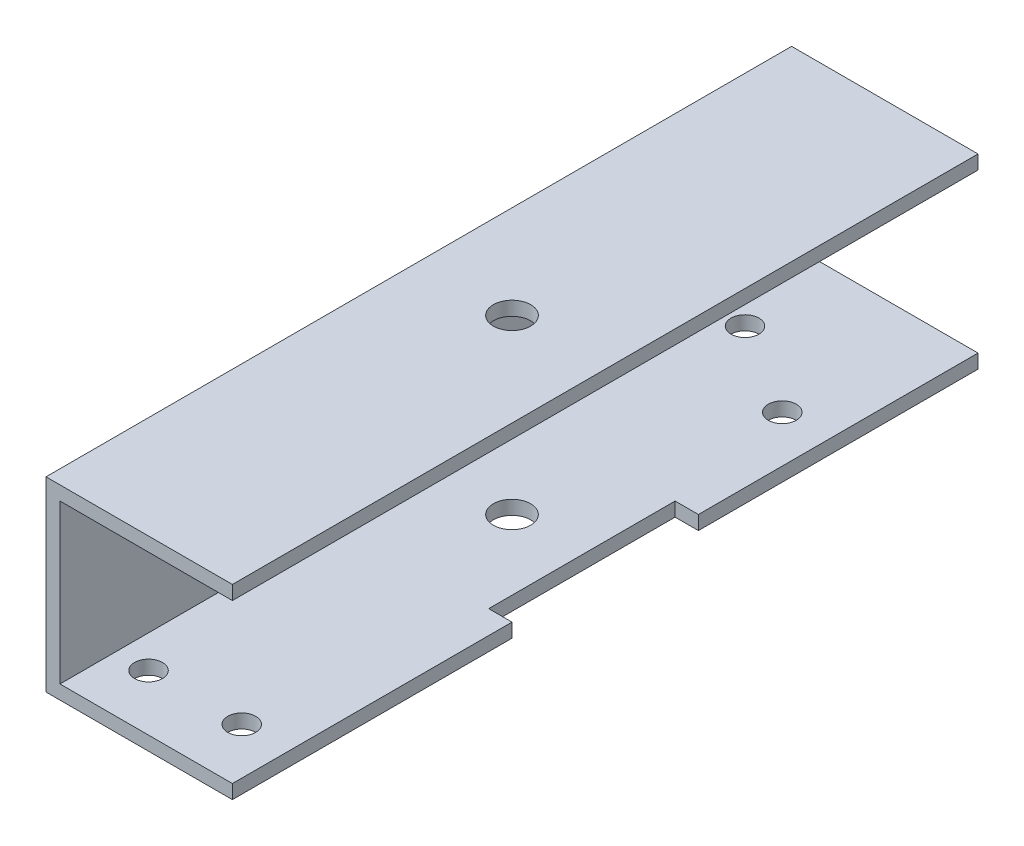
ISO-10303-21;
HEADER;
FILE_DESCRIPTION(('STEP AP214'),'2;1');
FILE_NAME('part.step','',(''),(''),'','','');
FILE_SCHEMA(('AUTOMOTIVE_DESIGN { 1 0 10303 214 1 1 1 1 }'));
ENDSEC;
DATA;
#1=APPLICATION_CONTEXT('core data for automotive mechanical design processes');
#2=APPLICATION_PROTOCOL_DEFINITION('international standard','automotive_design',2000,#1);
#3=PRODUCT_CONTEXT('',#1,'mechanical');
#4=PRODUCT('Part','Part','',(#3));
#5=PRODUCT_RELATED_PRODUCT_CATEGORY('part','',(#4));
#6=PRODUCT_DEFINITION_FORMATION('','',#4);
#7=PRODUCT_DEFINITION_CONTEXT('part definition',#1,'design');
#8=PRODUCT_DEFINITION('design','',#6,#7);
#9=PRODUCT_DEFINITION_SHAPE('','',#8);
#10=(LENGTH_UNIT() NAMED_UNIT(*) SI_UNIT(.MILLI.,.METRE.));
#11=(NAMED_UNIT(*) PLANE_ANGLE_UNIT() SI_UNIT($,.RADIAN.));
#12=(NAMED_UNIT(*) SI_UNIT($,.STERADIAN.) SOLID_ANGLE_UNIT());
#13=UNCERTAINTY_MEASURE_WITH_UNIT(LENGTH_MEASURE(1.E-05),#10,'distance_accuracy_value','');
#14=(GEOMETRIC_REPRESENTATION_CONTEXT(3) GLOBAL_UNCERTAINTY_ASSIGNED_CONTEXT((#13)) GLOBAL_UNIT_ASSIGNED_CONTEXT((#10,
#11,#12)) REPRESENTATION_CONTEXT('',''));
#15=CARTESIAN_POINT('',(0.,0.,0.));
#16=DIRECTION('',(0.,0.,1.));
#17=DIRECTION('',(1.,0.,0.));
#18=AXIS2_PLACEMENT_3D('',#15,#16,#17);
#19=CARTESIAN_POINT('',(-9.28680853526371,12.1298087141339,80.));
#20=DIRECTION('',(-1.,0.,0.));
#21=DIRECTION('',(0.,0.,1.));
#22=AXIS2_PLACEMENT_3D('',#19,#20,#21);
#23=PLANE('',#22);
#24=DIRECTION('',(0.,0.,-1.));
#25=VECTOR('',#24,1.);
#26=CARTESIAN_POINT('',(-9.28680853526371,12.1298087141339,80.));
#27=LINE('',#26,#25);
#28=CARTESIAN_POINT('',(-9.28680853526371,12.1298087141339,30.));
#29=VERTEX_POINT('',#28);
#30=CARTESIAN_POINT('',(-9.28680853526371,12.1298087141339,0.));
#31=VERTEX_POINT('',#30);
#32=EDGE_CURVE('E162',#29,#31,#27,.T.);
#33=ORIENTED_EDGE('',*,*,#32,.F.);
#34=DIRECTION('',(0.,-1.,0.));
#35=VECTOR('',#34,1.);
#36=CARTESIAN_POINT('',(-9.28680853526371,20.6298087141339,30.));
#37=LINE('',#36,#35);
#38=CARTESIAN_POINT('',(-9.28680853526371,10.6298087141339,30.));
#39=VERTEX_POINT('',#38);
#40=EDGE_CURVE('E213',#29,#39,#37,.T.);
#41=ORIENTED_EDGE('',*,*,#40,.T.);
#42=DIRECTION('',(0.,0.,-1.));
#43=VECTOR('',#42,1.);
#44=CARTESIAN_POINT('',(-9.28680853526371,10.6298087141339,80.));
#45=LINE('',#44,#43);
#46=CARTESIAN_POINT('',(-9.28680853526371,10.6298087141339,0.));
#47=VERTEX_POINT('',#46);
#48=EDGE_CURVE('E166',#39,#47,#45,.T.);
#49=ORIENTED_EDGE('',*,*,#48,.T.);
#50=DIRECTION('',(0.,1.,0.));
#51=VECTOR('',#50,1.);
#52=CARTESIAN_POINT('',(-9.28680853526371,12.1298087141339,0.));
#53=LINE('',#52,#51);
#54=EDGE_CURVE('E149',#47,#31,#53,.T.);
#55=ORIENTED_EDGE('',*,*,#54,.T.);
#56=EDGE_LOOP('',(#33,#41,#49,#55));
#57=FACE_BOUND('',#56,.T.);
#58=ADVANCED_FACE('F30',(#57),#23,.F.);
#59=CARTESIAN_POINT('',(-9.28680853526372,30.6298087141339,80.));
#60=DIRECTION('',(0.,-1.,0.));
#61=DIRECTION('',(0.,0.,-1.));
#62=AXIS2_PLACEMENT_3D('',#59,#60,#61);
#63=PLANE('',#62);
#64=CARTESIAN_POINT('',(-19.2868085352637,30.6298087141339,40.));
#65=DIRECTION('',(0.,-1.,0.));
#66=DIRECTION('',(0.,0.,-1.));
#67=AXIS2_PLACEMENT_3D('',#64,#65,#66);
#68=CIRCLE('',#67,2.);
#69=CARTESIAN_POINT('',(-19.2868085352637,30.6298087141339,38.));
#70=VERTEX_POINT('',#69);
#71=EDGE_CURVE('E463',#70,#70,#68,.T.);
#72=ORIENTED_EDGE('',*,*,#71,.T.);
#73=EDGE_LOOP('',(#72));
#74=FACE_BOUND('',#73,.T.);
#75=DIRECTION('',(-1.,0.,0.));
#76=VECTOR('',#75,1.);
#77=CARTESIAN_POINT('',(-9.28680853526372,30.6298087141339,0.));
#78=LINE('',#77,#76);
#79=CARTESIAN_POINT('',(-9.28680853526372,30.6298087141339,0.));
#80=VERTEX_POINT('',#79);
#81=CARTESIAN_POINT('',(-29.2868085352637,30.6298087141339,0.));
#82=VERTEX_POINT('',#81);
#83=EDGE_CURVE('E140',#80,#82,#78,.T.);
#84=ORIENTED_EDGE('',*,*,#83,.T.);
#85=DIRECTION('',(0.,0.,-1.));
#86=VECTOR('',#85,1.);
#87=CARTESIAN_POINT('',(-29.2868085352637,30.6298087141339,80.));
#88=LINE('',#87,#86);
#89=CARTESIAN_POINT('',(-29.2868085352637,30.6298087141339,80.));
#90=VERTEX_POINT('',#89);
#91=EDGE_CURVE('E173',#90,#82,#88,.T.);
#92=ORIENTED_EDGE('',*,*,#91,.F.);
#93=DIRECTION('',(-1.,0.,0.));
#94=VECTOR('',#93,1.);
#95=CARTESIAN_POINT('',(-9.28680853526372,30.6298087141339,80.));
#96=LINE('',#95,#94);
#97=CARTESIAN_POINT('',(-9.28680853526372,30.6298087141339,80.));
#98=VERTEX_POINT('',#97);
#99=EDGE_CURVE('E158',#98,#90,#96,.T.);
#100=ORIENTED_EDGE('',*,*,#99,.F.);
#101=DIRECTION('',(0.,0.,-1.));
#102=VECTOR('',#101,1.);
#103=CARTESIAN_POINT('',(-9.28680853526372,30.6298087141339,80.));
#104=LINE('',#103,#102);
#105=EDGE_CURVE('E136',#98,#80,#104,.T.);
#106=ORIENTED_EDGE('',*,*,#105,.T.);
#107=EDGE_LOOP('',(#84,#92,#100,#106));
#108=FACE_BOUND('',#107,.T.);
#109=ADVANCED_FACE('F32',(#74,#108),#63,.F.);
#110=CARTESIAN_POINT('',(-29.2868085352637,30.6298087141339,80.));
#111=DIRECTION('',(1.,0.,0.));
#112=DIRECTION('',(0.,1.,0.));
#113=AXIS2_PLACEMENT_3D('',#110,#111,#112);
#114=PLANE('',#113);
#115=DIRECTION('',(0.,-1.,0.));
#116=VECTOR('',#115,1.);
#117=CARTESIAN_POINT('',(-29.2868085352637,30.6298087141339,0.));
#118=LINE('',#117,#116);
#119=CARTESIAN_POINT('',(-29.2868085352637,10.6298087141339,0.));
#120=VERTEX_POINT('',#119);
#121=EDGE_CURVE('E143',#82,#120,#118,.T.);
#122=ORIENTED_EDGE('',*,*,#121,.T.);
#123=DIRECTION('',(0.,0.,-1.));
#124=VECTOR('',#123,1.);
#125=CARTESIAN_POINT('',(-29.2868085352637,10.6298087141339,80.));
#126=LINE('',#125,#124);
#127=CARTESIAN_POINT('',(-29.2868085352637,10.6298087141339,80.));
#128=VERTEX_POINT('',#127);
#129=EDGE_CURVE('E170',#128,#120,#126,.T.);
#130=ORIENTED_EDGE('',*,*,#129,.F.);
#131=DIRECTION('',(0.,-1.,0.));
#132=VECTOR('',#131,1.);
#133=CARTESIAN_POINT('',(-29.2868085352637,30.6298087141339,80.));
#134=LINE('',#133,#132);
#135=EDGE_CURVE('E97',#90,#128,#134,.T.);
#136=ORIENTED_EDGE('',*,*,#135,.F.);
#137=ORIENTED_EDGE('',*,*,#91,.T.);
#138=EDGE_LOOP('',(#122,#130,#136,#137));
#139=FACE_BOUND('',#138,.T.);
#140=ADVANCED_FACE('F253',(#139),#114,.F.);
#141=CARTESIAN_POINT('',(-29.2868085352637,10.6298087141339,80.));
#142=DIRECTION('',(0.,1.,0.));
#143=DIRECTION('',(0.,0.,1.));
#144=AXIS2_PLACEMENT_3D('',#141,#142,#143);
#145=PLANE('',#144);
#146=CARTESIAN_POINT('',(-19.2868085352637,10.6298087141339,40.));
#147=DIRECTION('',(0.,-1.,0.));
#148=DIRECTION('',(0.,0.,-1.));
#149=AXIS2_PLACEMENT_3D('',#146,#147,#148);
#150=CIRCLE('',#149,2.);
#151=CARTESIAN_POINT('',(-19.2868085352637,10.6298087141339,38.));
#152=VERTEX_POINT('',#151);
#153=EDGE_CURVE('E303',#152,#152,#150,.T.);
#154=ORIENTED_EDGE('',*,*,#153,.F.);
#155=EDGE_LOOP('',(#154));
#156=FACE_BOUND('',#155,.T.);
#157=CARTESIAN_POINT('',(-24.2868085352637,10.6298087141339,10.));
#158=DIRECTION('',(0.,-1.,0.));
#159=DIRECTION('',(0.,0.,-1.));
#160=AXIS2_PLACEMENT_3D('',#157,#158,#159);
#161=CIRCLE('',#160,1.5);
#162=CARTESIAN_POINT('',(-24.2868085352637,10.6298087141339,8.5));
#163=VERTEX_POINT('',#162);
#164=EDGE_CURVE('E190',#163,#163,#161,.T.);
#165=ORIENTED_EDGE('',*,*,#164,.F.);
#166=EDGE_LOOP('',(#165));
#167=FACE_BOUND('',#166,.T.);
#168=CARTESIAN_POINT('',(-14.2868085352637,10.6298087141339,16.));
#169=DIRECTION('',(0.,-1.,0.));
#170=DIRECTION('',(0.,0.,-1.));
#171=AXIS2_PLACEMENT_3D('',#168,#169,#170);
#172=CIRCLE('',#171,1.5);
#173=CARTESIAN_POINT('',(-14.2868085352637,10.6298087141339,14.5));
#174=VERTEX_POINT('',#173);
#175=EDGE_CURVE('E186',#174,#174,#172,.T.);
#176=ORIENTED_EDGE('',*,*,#175,.F.);
#177=EDGE_LOOP('',(#176));
#178=FACE_BOUND('',#177,.T.);
#179=CARTESIAN_POINT('',(-24.2868085352637,10.6298087141339,74.));
#180=DIRECTION('',(0.,-1.,0.));
#181=DIRECTION('',(0.,0.,-1.));
#182=AXIS2_PLACEMENT_3D('',#179,#180,#181);
#183=CIRCLE('',#182,1.5);
#184=CARTESIAN_POINT('',(-24.2868085352637,10.6298087141339,72.5));
#185=VERTEX_POINT('',#184);
#186=EDGE_CURVE('E182',#185,#185,#183,.T.);
#187=ORIENTED_EDGE('',*,*,#186,.F.);
#188=EDGE_LOOP('',(#187));
#189=FACE_BOUND('',#188,.T.);
#190=CARTESIAN_POINT('',(-14.2868085352637,10.6298087141339,74.));
#191=DIRECTION('',(0.,-1.,0.));
#192=DIRECTION('',(0.,0.,-1.));
#193=AXIS2_PLACEMENT_3D('',#190,#191,#192);
#194=CIRCLE('',#193,1.5);
#195=CARTESIAN_POINT('',(-14.2868085352637,10.6298087141339,72.5));
#196=VERTEX_POINT('',#195);
#197=EDGE_CURVE('E178',#196,#196,#194,.T.);
#198=ORIENTED_EDGE('',*,*,#197,.F.);
#199=EDGE_LOOP('',(#198));
#200=FACE_BOUND('',#199,.T.);
#201=ORIENTED_EDGE('',*,*,#48,.F.);
#202=DIRECTION('',(1.,0.,0.));
#203=VECTOR('',#202,1.);
#204=CARTESIAN_POINT('',(-9.28680853526371,10.6298087141339,30.));
#205=LINE('',#204,#203);
#206=CARTESIAN_POINT('',(-11.7868085352637,10.6298087141339,30.));
#207=VERTEX_POINT('',#206);
#208=EDGE_CURVE('E223',#207,#39,#205,.T.);
#209=ORIENTED_EDGE('',*,*,#208,.F.);
#210=DIRECTION('',(0.,0.,-1.));
#211=VECTOR('',#210,1.);
#212=CARTESIAN_POINT('',(-11.7868085352637,10.6298087141339,50.));
#213=LINE('',#212,#211);
#214=CARTESIAN_POINT('',(-11.7868085352637,10.6298087141339,50.));
#215=VERTEX_POINT('',#214);
#216=EDGE_CURVE('E209',#215,#207,#213,.T.);
#217=ORIENTED_EDGE('',*,*,#216,.F.);
#218=DIRECTION('',(-1.,0.,0.));
#219=VECTOR('',#218,1.);
#220=CARTESIAN_POINT('',(-9.28680853526371,10.6298087141339,50.));
#221=LINE('',#220,#219);
#222=CARTESIAN_POINT('',(-9.28680853526371,10.6298087141339,50.));
#223=VERTEX_POINT('',#222);
#224=EDGE_CURVE('E260',#223,#215,#221,.T.);
#225=ORIENTED_EDGE('',*,*,#224,.F.);
#226=CARTESIAN_POINT('',(-9.28680853526371,10.6298087141339,80.));
#227=VERTEX_POINT('',#226);
#228=EDGE_CURVE('E167',#227,#223,#45,.T.);
#229=ORIENTED_EDGE('',*,*,#228,.F.);
#230=DIRECTION('',(1.,0.,0.));
#231=VECTOR('',#230,1.);
#232=CARTESIAN_POINT('',(-29.2868085352637,10.6298087141339,80.));
#233=LINE('',#232,#231);
#234=EDGE_CURVE('E234',#128,#227,#233,.T.);
#235=ORIENTED_EDGE('',*,*,#234,.F.);
#236=ORIENTED_EDGE('',*,*,#129,.T.);
#237=DIRECTION('',(1.,0.,0.));
#238=VECTOR('',#237,1.);
#239=CARTESIAN_POINT('',(-29.2868085352637,10.6298087141339,0.));
#240=LINE('',#239,#238);
#241=EDGE_CURVE('E146',#120,#47,#240,.T.);
#242=ORIENTED_EDGE('',*,*,#241,.T.);
#243=EDGE_LOOP('',(#201,#209,#217,#225,#229,#235,#236,#242));
#244=FACE_BOUND('',#243,.T.);
#245=ADVANCED_FACE('F257',(#156,#167,#178,#189,#200,#244),#145,.F.);
#246=ORIENTED_EDGE('',*,*,#228,.T.);
#247=DIRECTION('',(0.,-1.,0.));
#248=VECTOR('',#247,1.);
#249=CARTESIAN_POINT('',(-9.28680853526371,20.6298087141339,50.));
#250=LINE('',#249,#248);
#251=CARTESIAN_POINT('',(-9.28680853526371,12.1298087141339,50.));
#252=VERTEX_POINT('',#251);
#253=EDGE_CURVE('E217',#252,#223,#250,.T.);
#254=ORIENTED_EDGE('',*,*,#253,.F.);
#255=CARTESIAN_POINT('',(-9.28680853526371,12.1298087141339,80.));
#256=VERTEX_POINT('',#255);
#257=EDGE_CURVE('E163',#256,#252,#27,.T.);
#258=ORIENTED_EDGE('',*,*,#257,.F.);
#259=DIRECTION('',(0.,1.,0.));
#260=VECTOR('',#259,1.);
#261=CARTESIAN_POINT('',(-9.28680853526371,12.1298087141339,80.));
#262=LINE('',#261,#260);
#263=EDGE_CURVE('E236',#227,#256,#262,.T.);
#264=ORIENTED_EDGE('',*,*,#263,.F.);
#265=EDGE_LOOP('',(#246,#254,#258,#264));
#266=FACE_BOUND('',#265,.T.);
#267=ADVANCED_FACE('F243',(#266),#23,.F.);
#268=CARTESIAN_POINT('',(-9.28680853526371,12.1298087141339,80.));
#269=DIRECTION('',(0.,-1.,0.));
#270=DIRECTION('',(1.,0.,0.));
#271=AXIS2_PLACEMENT_3D('',#268,#269,#270);
#272=PLANE('',#271);
#273=CARTESIAN_POINT('',(-19.2868085352637,12.1298087141339,40.));
#274=DIRECTION('',(0.,-1.,0.));
#275=DIRECTION('',(1.,0.,0.));
#276=AXIS2_PLACEMENT_3D('',#273,#274,#275);
#277=CIRCLE('',#276,2.);
#278=CARTESIAN_POINT('',(-17.2868085352637,12.1298087141339,40.));
#279=VERTEX_POINT('',#278);
#280=EDGE_CURVE('E459',#279,#279,#277,.T.);
#281=ORIENTED_EDGE('',*,*,#280,.T.);
#282=EDGE_LOOP('',(#281));
#283=FACE_BOUND('',#282,.T.);
#284=CARTESIAN_POINT('',(-24.2868085352637,12.1298087141339,10.));
#285=DIRECTION('',(0.,-1.,0.));
#286=DIRECTION('',(1.,0.,0.));
#287=AXIS2_PLACEMENT_3D('',#284,#285,#286);
#288=CIRCLE('',#287,1.5);
#289=CARTESIAN_POINT('',(-22.7868085352637,12.1298087141339,10.));
#290=VERTEX_POINT('',#289);
#291=EDGE_CURVE('E187',#290,#290,#288,.T.);
#292=ORIENTED_EDGE('',*,*,#291,.T.);
#293=EDGE_LOOP('',(#292));
#294=FACE_BOUND('',#293,.T.);
#295=CARTESIAN_POINT('',(-14.2868085352637,12.1298087141339,16.));
#296=DIRECTION('',(0.,-1.,0.));
#297=DIRECTION('',(1.,0.,0.));
#298=AXIS2_PLACEMENT_3D('',#295,#296,#297);
#299=CIRCLE('',#298,1.5);
#300=CARTESIAN_POINT('',(-12.7868085352637,12.1298087141339,16.));
#301=VERTEX_POINT('',#300);
#302=EDGE_CURVE('E183',#301,#301,#299,.T.);
#303=ORIENTED_EDGE('',*,*,#302,.T.);
#304=EDGE_LOOP('',(#303));
#305=FACE_BOUND('',#304,.T.);
#306=CARTESIAN_POINT('',(-24.2868085352637,12.1298087141339,74.));
#307=DIRECTION('',(0.,-1.,0.));
#308=DIRECTION('',(1.,0.,0.));
#309=AXIS2_PLACEMENT_3D('',#306,#307,#308);
#310=CIRCLE('',#309,1.5);
#311=CARTESIAN_POINT('',(-22.7868085352637,12.1298087141339,74.));
#312=VERTEX_POINT('',#311);
#313=EDGE_CURVE('E179',#312,#312,#310,.T.);
#314=ORIENTED_EDGE('',*,*,#313,.T.);
#315=EDGE_LOOP('',(#314));
#316=FACE_BOUND('',#315,.T.);
#317=CARTESIAN_POINT('',(-14.2868085352637,12.1298087141339,74.));
#318=DIRECTION('',(0.,-1.,0.));
#319=DIRECTION('',(1.,0.,0.));
#320=AXIS2_PLACEMENT_3D('',#317,#318,#319);
#321=CIRCLE('',#320,1.5);
#322=CARTESIAN_POINT('',(-12.7868085352637,12.1298087141339,74.));
#323=VERTEX_POINT('',#322);
#324=EDGE_CURVE('E144',#323,#323,#321,.T.);
#325=ORIENTED_EDGE('',*,*,#324,.T.);
#326=EDGE_LOOP('',(#325));
#327=FACE_BOUND('',#326,.T.);
#328=DIRECTION('',(0.,0.,-1.));
#329=VECTOR('',#328,1.);
#330=CARTESIAN_POINT('',(-11.7868085352637,12.1298087141339,80.));
#331=LINE('',#330,#329);
#332=CARTESIAN_POINT('',(-11.7868085352637,12.1298087141339,50.));
#333=VERTEX_POINT('',#332);
#334=CARTESIAN_POINT('',(-11.7868085352637,12.1298087141339,30.));
#335=VERTEX_POINT('',#334);
#336=EDGE_CURVE('E39',#333,#335,#331,.T.);
#337=ORIENTED_EDGE('',*,*,#336,.T.);
#338=DIRECTION('',(1.,0.,0.));
#339=VECTOR('',#338,1.);
#340=CARTESIAN_POINT('',(-9.28680853526378,12.1298087141339,30.));
#341=LINE('',#340,#339);
#342=EDGE_CURVE('E11',#335,#29,#341,.T.);
#343=ORIENTED_EDGE('',*,*,#342,.T.);
#344=ORIENTED_EDGE('',*,*,#32,.T.);
#345=DIRECTION('',(-1.,0.,0.));
#346=VECTOR('',#345,1.);
#347=CARTESIAN_POINT('',(-9.28680853526371,12.1298087141339,0.));
#348=LINE('',#347,#346);
#349=CARTESIAN_POINT('',(-27.7868085352637,12.1298087141339,0.));
#350=VERTEX_POINT('',#349);
#351=EDGE_CURVE('E152',#31,#350,#348,.T.);
#352=ORIENTED_EDGE('',*,*,#351,.T.);
#353=DIRECTION('',(0.,0.,-1.));
#354=VECTOR('',#353,1.);
#355=CARTESIAN_POINT('',(-27.7868085352637,12.1298087141339,80.));
#356=LINE('',#355,#354);
#357=CARTESIAN_POINT('',(-27.7868085352637,12.1298087141339,80.));
#358=VERTEX_POINT('',#357);
#359=EDGE_CURVE('E131',#358,#350,#356,.T.);
#360=ORIENTED_EDGE('',*,*,#359,.F.);
#361=DIRECTION('',(-1.,0.,0.));
#362=VECTOR('',#361,1.);
#363=CARTESIAN_POINT('',(-9.28680853526371,12.1298087141339,80.));
#364=LINE('',#363,#362);
#365=EDGE_CURVE('E119',#256,#358,#364,.T.);
#366=ORIENTED_EDGE('',*,*,#365,.F.);
#367=ORIENTED_EDGE('',*,*,#257,.T.);
#368=DIRECTION('',(-1.,0.,0.));
#369=VECTOR('',#368,1.);
#370=CARTESIAN_POINT('',(-9.28680853526371,12.1298087141339,50.));
#371=LINE('',#370,#369);
#372=EDGE_CURVE('E175',#252,#333,#371,.T.);
#373=ORIENTED_EDGE('',*,*,#372,.T.);
#374=EDGE_LOOP('',(#337,#343,#344,#352,#360,#366,#367,#373));
#375=FACE_BOUND('',#374,.T.);
#376=ADVANCED_FACE('F196',(#283,#294,#305,#316,#327,#375),#272,.F.);
#377=CARTESIAN_POINT('',(-27.7868085352637,12.1298087141339,80.));
#378=DIRECTION('',(-1.,0.,0.));
#379=DIRECTION('',(0.,-1.,0.));
#380=AXIS2_PLACEMENT_3D('',#377,#378,#379);
#381=PLANE('',#380);
#382=DIRECTION('',(0.,1.,0.));
#383=VECTOR('',#382,1.);
#384=CARTESIAN_POINT('',(-27.7868085352637,12.1298087141339,0.));
#385=LINE('',#384,#383);
#386=CARTESIAN_POINT('',(-27.7868085352637,29.1298087141339,0.));
#387=VERTEX_POINT('',#386);
#388=EDGE_CURVE('E128',#350,#387,#385,.T.);
#389=ORIENTED_EDGE('',*,*,#388,.T.);
#390=DIRECTION('',(0.,0.,-1.));
#391=VECTOR('',#390,1.);
#392=CARTESIAN_POINT('',(-27.7868085352637,29.1298087141339,80.));
#393=LINE('',#392,#391);
#394=CARTESIAN_POINT('',(-27.7868085352637,29.1298087141339,80.));
#395=VERTEX_POINT('',#394);
#396=EDGE_CURVE('E125',#395,#387,#393,.T.);
#397=ORIENTED_EDGE('',*,*,#396,.F.);
#398=DIRECTION('',(0.,1.,0.));
#399=VECTOR('',#398,1.);
#400=CARTESIAN_POINT('',(-27.7868085352637,12.1298087141339,80.));
#401=LINE('',#400,#399);
#402=EDGE_CURVE('E112',#358,#395,#401,.T.);
#403=ORIENTED_EDGE('',*,*,#402,.F.);
#404=ORIENTED_EDGE('',*,*,#359,.T.);
#405=EDGE_LOOP('',(#389,#397,#403,#404));
#406=FACE_BOUND('',#405,.T.);
#407=ADVANCED_FACE('F126',(#406),#381,.F.);
#408=CARTESIAN_POINT('',(-27.7868085352637,29.1298087141339,80.));
#409=DIRECTION('',(0.,1.,0.));
#410=DIRECTION('',(0.,0.,1.));
#411=AXIS2_PLACEMENT_3D('',#408,#409,#410);
#412=PLANE('',#411);
#413=CARTESIAN_POINT('',(-19.2868085352637,29.1298087141339,40.));
#414=DIRECTION('',(0.,1.,0.));
#415=DIRECTION('',(0.,0.,1.));
#416=AXIS2_PLACEMENT_3D('',#413,#414,#415);
#417=CIRCLE('',#416,2.);
#418=CARTESIAN_POINT('',(-19.2868085352637,29.1298087141339,42.));
#419=VERTEX_POINT('',#418);
#420=EDGE_CURVE('E34',#419,#419,#417,.T.);
#421=ORIENTED_EDGE('',*,*,#420,.T.);
#422=EDGE_LOOP('',(#421));
#423=FACE_BOUND('',#422,.T.);
#424=DIRECTION('',(1.,0.,0.));
#425=VECTOR('',#424,1.);
#426=CARTESIAN_POINT('',(-27.7868085352637,29.1298087141339,0.));
#427=LINE('',#426,#425);
#428=CARTESIAN_POINT('',(-9.28680853526372,29.1298087141339,0.));
#429=VERTEX_POINT('',#428);
#430=EDGE_CURVE('E155',#387,#429,#427,.T.);
#431=ORIENTED_EDGE('',*,*,#430,.T.);
#432=DIRECTION('',(0.,0.,-1.));
#433=VECTOR('',#432,1.);
#434=CARTESIAN_POINT('',(-9.28680853526372,29.1298087141339,80.));
#435=LINE('',#434,#433);
#436=CARTESIAN_POINT('',(-9.28680853526372,29.1298087141339,80.));
#437=VERTEX_POINT('',#436);
#438=EDGE_CURVE('E132',#437,#429,#435,.T.);
#439=ORIENTED_EDGE('',*,*,#438,.F.);
#440=DIRECTION('',(1.,0.,0.));
#441=VECTOR('',#440,1.);
#442=CARTESIAN_POINT('',(-27.7868085352637,29.1298087141339,80.));
#443=LINE('',#442,#441);
#444=EDGE_CURVE('E116',#395,#437,#443,.T.);
#445=ORIENTED_EDGE('',*,*,#444,.F.);
#446=ORIENTED_EDGE('',*,*,#396,.T.);
#447=EDGE_LOOP('',(#431,#439,#445,#446));
#448=FACE_BOUND('',#447,.T.);
#449=ADVANCED_FACE('F134',(#423,#448),#412,.F.);
#450=CARTESIAN_POINT('',(-9.28680853526372,29.1298087141339,80.));
#451=DIRECTION('',(-1.,0.,0.));
#452=DIRECTION('',(0.,0.,1.));
#453=AXIS2_PLACEMENT_3D('',#450,#451,#452);
#454=PLANE('',#453);
#455=DIRECTION('',(0.,1.,0.));
#456=VECTOR('',#455,1.);
#457=CARTESIAN_POINT('',(-9.28680853526372,29.1298087141339,0.));
#458=LINE('',#457,#456);
#459=EDGE_CURVE('E88',#429,#80,#458,.T.);
#460=ORIENTED_EDGE('',*,*,#459,.T.);
#461=ORIENTED_EDGE('',*,*,#105,.F.);
#462=DIRECTION('',(0.,1.,0.));
#463=VECTOR('',#462,1.);
#464=CARTESIAN_POINT('',(-9.28680853526372,29.1298087141339,80.));
#465=LINE('',#464,#463);
#466=EDGE_CURVE('E55',#437,#98,#465,.T.);
#467=ORIENTED_EDGE('',*,*,#466,.F.);
#468=ORIENTED_EDGE('',*,*,#438,.T.);
#469=EDGE_LOOP('',(#460,#461,#467,#468));
#470=FACE_BOUND('',#469,.T.);
#471=ADVANCED_FACE('F249',(#470),#454,.F.);
#472=CARTESIAN_POINT('',(-29.2868085352637,30.6298087141339,80.));
#473=DIRECTION('',(0.,0.,1.));
#474=DIRECTION('',(1.,0.,0.));
#475=AXIS2_PLACEMENT_3D('',#472,#473,#474);
#476=PLANE('',#475);
#477=ORIENTED_EDGE('',*,*,#99,.T.);
#478=ORIENTED_EDGE('',*,*,#135,.T.);
#479=ORIENTED_EDGE('',*,*,#234,.T.);
#480=ORIENTED_EDGE('',*,*,#263,.T.);
#481=ORIENTED_EDGE('',*,*,#365,.T.);
#482=ORIENTED_EDGE('',*,*,#402,.T.);
#483=ORIENTED_EDGE('',*,*,#444,.T.);
#484=ORIENTED_EDGE('',*,*,#466,.T.);
#485=EDGE_LOOP('',(#477,#478,#479,#480,#481,#482,#483,#484));
#486=FACE_BOUND('',#485,.T.);
#487=ADVANCED_FACE('F114',(#486),#476,.T.);
#488=CARTESIAN_POINT('',(-29.2868085352637,30.6298087141339,0.));
#489=DIRECTION('',(0.,0.,1.));
#490=DIRECTION('',(1.,0.,0.));
#491=AXIS2_PLACEMENT_3D('',#488,#489,#490);
#492=PLANE('',#491);
#493=ORIENTED_EDGE('',*,*,#83,.F.);
#494=ORIENTED_EDGE('',*,*,#459,.F.);
#495=ORIENTED_EDGE('',*,*,#430,.F.);
#496=ORIENTED_EDGE('',*,*,#388,.F.);
#497=ORIENTED_EDGE('',*,*,#351,.F.);
#498=ORIENTED_EDGE('',*,*,#54,.F.);
#499=ORIENTED_EDGE('',*,*,#241,.F.);
#500=ORIENTED_EDGE('',*,*,#121,.F.);
#501=EDGE_LOOP('',(#493,#494,#495,#496,#497,#498,#499,#500));
#502=FACE_BOUND('',#501,.T.);
#503=ADVANCED_FACE('F247',(#502),#492,.F.);
#504=CARTESIAN_POINT('',(-14.2868085352637,20.6298087141339,74.));
#505=DIRECTION('',(0.,-1.,0.));
#506=DIRECTION('',(0.,0.,-1.));
#507=AXIS2_PLACEMENT_3D('',#504,#505,#506);
#508=CYLINDRICAL_SURFACE('',#507,1.5);
#509=ORIENTED_EDGE('',*,*,#197,.T.);
#510=EDGE_LOOP('',(#509));
#511=FACE_BOUND('',#510,.T.);
#512=ORIENTED_EDGE('',*,*,#324,.F.);
#513=EDGE_LOOP('',(#512));
#514=FACE_BOUND('',#513,.T.);
#515=ADVANCED_FACE('F312',(#511,#514),#508,.F.);
#516=CARTESIAN_POINT('',(-24.2868085352637,20.6298087141339,74.));
#517=DIRECTION('',(0.,-1.,0.));
#518=DIRECTION('',(0.,0.,-1.));
#519=AXIS2_PLACEMENT_3D('',#516,#517,#518);
#520=CYLINDRICAL_SURFACE('',#519,1.5);
#521=ORIENTED_EDGE('',*,*,#186,.T.);
#522=EDGE_LOOP('',(#521));
#523=FACE_BOUND('',#522,.T.);
#524=ORIENTED_EDGE('',*,*,#313,.F.);
#525=EDGE_LOOP('',(#524));
#526=FACE_BOUND('',#525,.T.);
#527=ADVANCED_FACE('F315',(#523,#526),#520,.F.);
#528=CARTESIAN_POINT('',(-14.2868085352637,20.6298087141339,16.));
#529=DIRECTION('',(0.,-1.,0.));
#530=DIRECTION('',(0.,0.,-1.));
#531=AXIS2_PLACEMENT_3D('',#528,#529,#530);
#532=CYLINDRICAL_SURFACE('',#531,1.5);
#533=ORIENTED_EDGE('',*,*,#175,.T.);
#534=EDGE_LOOP('',(#533));
#535=FACE_BOUND('',#534,.T.);
#536=ORIENTED_EDGE('',*,*,#302,.F.);
#537=EDGE_LOOP('',(#536));
#538=FACE_BOUND('',#537,.T.);
#539=ADVANCED_FACE('F323',(#535,#538),#532,.F.);
#540=CARTESIAN_POINT('',(-24.2868085352637,20.6298087141339,10.));
#541=DIRECTION('',(0.,-1.,0.));
#542=DIRECTION('',(0.,0.,-1.));
#543=AXIS2_PLACEMENT_3D('',#540,#541,#542);
#544=CYLINDRICAL_SURFACE('',#543,1.5);
#545=ORIENTED_EDGE('',*,*,#164,.T.);
#546=EDGE_LOOP('',(#545));
#547=FACE_BOUND('',#546,.T.);
#548=ORIENTED_EDGE('',*,*,#291,.F.);
#549=EDGE_LOOP('',(#548));
#550=FACE_BOUND('',#549,.T.);
#551=ADVANCED_FACE('F388',(#547,#550),#544,.F.);
#552=CARTESIAN_POINT('',(-9.28680853526371,20.6298087141339,30.));
#553=DIRECTION('',(0.,0.,-1.));
#554=DIRECTION('',(-1.,0.,0.));
#555=AXIS2_PLACEMENT_3D('',#552,#553,#554);
#556=PLANE('',#555);
#557=DIRECTION('',(0.,-1.,0.));
#558=VECTOR('',#557,1.);
#559=CARTESIAN_POINT('',(-11.7868085352637,20.6298087141339,30.));
#560=LINE('',#559,#558);
#561=EDGE_CURVE('E206',#335,#207,#560,.T.);
#562=ORIENTED_EDGE('',*,*,#561,.T.);
#563=ORIENTED_EDGE('',*,*,#208,.T.);
#564=ORIENTED_EDGE('',*,*,#40,.F.);
#565=ORIENTED_EDGE('',*,*,#342,.F.);
#566=EDGE_LOOP('',(#562,#563,#564,#565));
#567=FACE_BOUND('',#566,.T.);
#568=ADVANCED_FACE('F278',(#567),#556,.F.);
#569=CARTESIAN_POINT('',(-11.7868085352637,20.6298087141339,50.));
#570=DIRECTION('',(-1.,0.,0.));
#571=DIRECTION('',(0.,0.,1.));
#572=AXIS2_PLACEMENT_3D('',#569,#570,#571);
#573=PLANE('',#572);
#574=DIRECTION('',(0.,-1.,0.));
#575=VECTOR('',#574,1.);
#576=CARTESIAN_POINT('',(-11.7868085352637,20.6298087141339,50.));
#577=LINE('',#576,#575);
#578=EDGE_CURVE('E46',#333,#215,#577,.T.);
#579=ORIENTED_EDGE('',*,*,#578,.T.);
#580=ORIENTED_EDGE('',*,*,#216,.T.);
#581=ORIENTED_EDGE('',*,*,#561,.F.);
#582=ORIENTED_EDGE('',*,*,#336,.F.);
#583=EDGE_LOOP('',(#579,#580,#581,#582));
#584=FACE_BOUND('',#583,.T.);
#585=ADVANCED_FACE('F202',(#584),#573,.F.);
#586=CARTESIAN_POINT('',(-9.28680853526371,20.6298087141339,50.));
#587=DIRECTION('',(0.,0.,1.));
#588=DIRECTION('',(1.,0.,0.));
#589=AXIS2_PLACEMENT_3D('',#586,#587,#588);
#590=PLANE('',#589);
#591=ORIENTED_EDGE('',*,*,#253,.T.);
#592=ORIENTED_EDGE('',*,*,#224,.T.);
#593=ORIENTED_EDGE('',*,*,#578,.F.);
#594=ORIENTED_EDGE('',*,*,#372,.F.);
#595=EDGE_LOOP('',(#591,#592,#593,#594));
#596=FACE_BOUND('',#595,.T.);
#597=ADVANCED_FACE('F267',(#596),#590,.F.);
#598=CARTESIAN_POINT('',(-19.2868085352637,30.6298087141339,40.));
#599=DIRECTION('',(0.,-1.,0.));
#600=DIRECTION('',(0.,0.,-1.));
#601=AXIS2_PLACEMENT_3D('',#598,#599,#600);
#602=CYLINDRICAL_SURFACE('',#601,2.);
#603=ORIENTED_EDGE('',*,*,#71,.F.);
#604=EDGE_LOOP('',(#603));
#605=FACE_BOUND('',#604,.T.);
#606=ORIENTED_EDGE('',*,*,#420,.F.);
#607=EDGE_LOOP('',(#606));
#608=FACE_BOUND('',#607,.T.);
#609=ADVANCED_FACE('F269',(#605,#608),#602,.F.);
#610=ORIENTED_EDGE('',*,*,#153,.T.);
#611=EDGE_LOOP('',(#610));
#612=FACE_BOUND('',#611,.T.);
#613=ORIENTED_EDGE('',*,*,#280,.F.);
#614=EDGE_LOOP('',(#613));
#615=FACE_BOUND('',#614,.T.);
#616=ADVANCED_FACE('F275',(#612,#615),#602,.F.);
#617=CLOSED_SHELL('',(#58,#109,#140,#245,#267,#376,#407,#449,#471,#487,#503,#515,#527,#539,#551,
#568,#585,#597,#609,#616));
#618=MANIFOLD_SOLID_BREP('B2',#617);
#619=ADVANCED_BREP_SHAPE_REPRESENTATION('',(#18,#618),#14);
#620=SHAPE_DEFINITION_REPRESENTATION(#9,#619);
ENDSEC;
END-ISO-10303-21;
